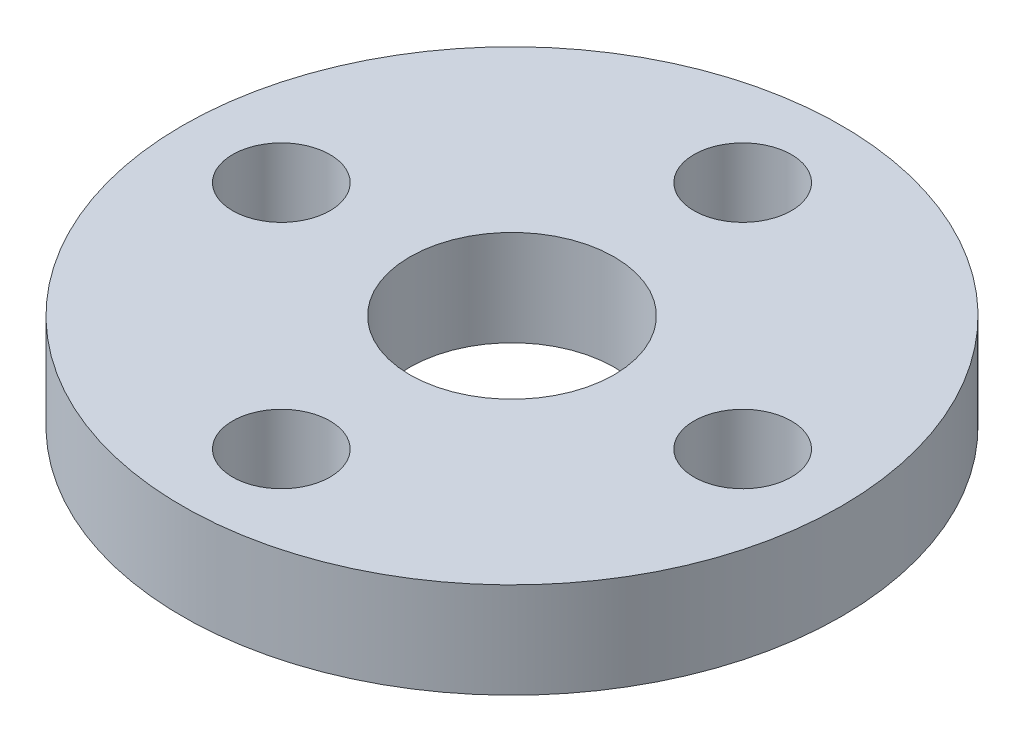
ISO-10303-21;
HEADER;
FILE_DESCRIPTION(('STEP AP214'),'2;1');
FILE_NAME('part.step','',(''),(''),'','','');
FILE_SCHEMA(('AUTOMOTIVE_DESIGN { 1 0 10303 214 1 1 1 1 }'));
ENDSEC;
DATA;
#1=APPLICATION_CONTEXT('core data for automotive mechanical design processes');
#2=APPLICATION_PROTOCOL_DEFINITION('international standard','automotive_design',2000,#1);
#3=PRODUCT_CONTEXT('',#1,'mechanical');
#4=PRODUCT('Part','Part','',(#3));
#5=PRODUCT_RELATED_PRODUCT_CATEGORY('part','',(#4));
#6=PRODUCT_DEFINITION_FORMATION('','',#4);
#7=PRODUCT_DEFINITION_CONTEXT('part definition',#1,'design');
#8=PRODUCT_DEFINITION('design','',#6,#7);
#9=PRODUCT_DEFINITION_SHAPE('','',#8);
#10=(LENGTH_UNIT() NAMED_UNIT(*) SI_UNIT(.MILLI.,.METRE.));
#11=(NAMED_UNIT(*) PLANE_ANGLE_UNIT() SI_UNIT($,.RADIAN.));
#12=(NAMED_UNIT(*) SI_UNIT($,.STERADIAN.) SOLID_ANGLE_UNIT());
#13=UNCERTAINTY_MEASURE_WITH_UNIT(LENGTH_MEASURE(1.E-05),#10,'distance_accuracy_value','');
#14=(GEOMETRIC_REPRESENTATION_CONTEXT(3) GLOBAL_UNCERTAINTY_ASSIGNED_CONTEXT((#13)) GLOBAL_UNIT_ASSIGNED_CONTEXT((#10,
#11,#12)) REPRESENTATION_CONTEXT('',''));
#15=CARTESIAN_POINT('',(0.,0.,0.));
#16=DIRECTION('',(0.,0.,1.));
#17=DIRECTION('',(1.,0.,0.));
#18=AXIS2_PLACEMENT_3D('',#15,#16,#17);
#19=CARTESIAN_POINT('',(-45.,48.15,13.5));
#20=DIRECTION('',(0.,1.,0.));
#21=DIRECTION('',(0.,0.,1.));
#22=AXIS2_PLACEMENT_3D('',#19,#20,#21);
#23=PLANE('',#22);
#24=CARTESIAN_POINT('',(-38.,48.15,10.));
#25=DIRECTION('',(0.,-1.,0.));
#26=DIRECTION('',(0.,0.,-1.));
#27=AXIS2_PLACEMENT_3D('',#24,#25,#26);
#28=CIRCLE('',#27,1.47782604588);
#29=CARTESIAN_POINT('',(-38.,48.15,8.52217395412));
#30=VERTEX_POINT('',#29);
#31=EDGE_CURVE('E10',#30,#30,#28,.T.);
#32=ORIENTED_EDGE('',*,*,#31,.T.);
#33=EDGE_LOOP('',(#32));
#34=FACE_BOUND('',#33,.T.);
#35=CARTESIAN_POINT('',(-45.,48.15,2.99999999999994));
#36=DIRECTION('',(0.,-1.,0.));
#37=DIRECTION('',(-1.,0.,0.));
#38=AXIS2_PLACEMENT_3D('',#35,#36,#37);
#39=CIRCLE('',#38,1.47782604588);
#40=CARTESIAN_POINT('',(-46.47782604588,48.15,2.99999999999994));
#41=VERTEX_POINT('',#40);
#42=EDGE_CURVE('E24',#41,#41,#39,.T.);
#43=ORIENTED_EDGE('',*,*,#42,.T.);
#44=EDGE_LOOP('',(#43));
#45=FACE_BOUND('',#44,.T.);
#46=CARTESIAN_POINT('',(-52.,48.15,10.));
#47=DIRECTION('',(0.,1.,0.));
#48=DIRECTION('',(0.,0.,1.));
#49=AXIS2_PLACEMENT_3D('',#46,#47,#48);
#50=CIRCLE('',#49,1.47782604588);
#51=CARTESIAN_POINT('',(-52.,48.15,11.47782604588));
#52=VERTEX_POINT('',#51);
#53=EDGE_CURVE('E34',#52,#52,#50,.T.);
#54=ORIENTED_EDGE('',*,*,#53,.F.);
#55=EDGE_LOOP('',(#54));
#56=FACE_BOUND('',#55,.T.);
#57=CARTESIAN_POINT('',(-45.,48.15,17.));
#58=DIRECTION('',(0.,-1.,0.));
#59=DIRECTION('',(1.,0.,0.));
#60=AXIS2_PLACEMENT_3D('',#57,#58,#59);
#61=CIRCLE('',#60,1.47782604588);
#62=CARTESIAN_POINT('',(-43.52217395412,48.15,17.));
#63=VERTEX_POINT('',#62);
#64=EDGE_CURVE('E64',#63,#63,#61,.T.);
#65=ORIENTED_EDGE('',*,*,#64,.T.);
#66=EDGE_LOOP('',(#65));
#67=FACE_BOUND('',#66,.T.);
#68=CARTESIAN_POINT('',(-45.,48.15,10.));
#69=DIRECTION('',(0.,1.,0.));
#70=DIRECTION('',(1.,0.,0.));
#71=AXIS2_PLACEMENT_3D('',#68,#69,#70);
#72=CIRCLE('',#71,10.);
#73=CARTESIAN_POINT('',(-35.,48.15,10.));
#74=VERTEX_POINT('',#73);
#75=EDGE_CURVE('E58',#74,#74,#72,.T.);
#76=ORIENTED_EDGE('',*,*,#75,.T.);
#77=EDGE_LOOP('',(#76));
#78=FACE_BOUND('',#77,.T.);
#79=CARTESIAN_POINT('',(-45.,48.15,10.));
#80=DIRECTION('',(0.,1.,0.));
#81=DIRECTION('',(0.,0.,1.));
#82=AXIS2_PLACEMENT_3D('',#79,#80,#81);
#83=CIRCLE('',#82,3.1);
#84=CARTESIAN_POINT('',(-45.,48.15,13.1));
#85=VERTEX_POINT('',#84);
#86=EDGE_CURVE('E72',#85,#85,#83,.F.);
#87=ORIENTED_EDGE('',*,*,#86,.T.);
#88=EDGE_LOOP('',(#87));
#89=FACE_BOUND('',#88,.T.);
#90=ADVANCED_FACE('F15',(#34,#45,#56,#67,#78,#89),#23,.T.);
#91=CARTESIAN_POINT('',(-45.,45.25,13.5));
#92=DIRECTION('',(0.,1.,0.));
#93=DIRECTION('',(0.,0.,1.));
#94=AXIS2_PLACEMENT_3D('',#91,#92,#93);
#95=PLANE('',#94);
#96=CARTESIAN_POINT('',(-38.,45.25,10.));
#97=DIRECTION('',(0.,-1.,0.));
#98=DIRECTION('',(0.,0.,-1.));
#99=AXIS2_PLACEMENT_3D('',#96,#97,#98);
#100=CIRCLE('',#99,1.47782604588);
#101=CARTESIAN_POINT('',(-38.,45.25,8.52217395412));
#102=VERTEX_POINT('',#101);
#103=EDGE_CURVE('E19',#102,#102,#100,.T.);
#104=ORIENTED_EDGE('',*,*,#103,.F.);
#105=EDGE_LOOP('',(#104));
#106=FACE_BOUND('',#105,.T.);
#107=CARTESIAN_POINT('',(-45.,45.25,2.99999999999994));
#108=DIRECTION('',(0.,-1.,0.));
#109=DIRECTION('',(-1.,0.,0.));
#110=AXIS2_PLACEMENT_3D('',#107,#108,#109);
#111=CIRCLE('',#110,1.47782604588);
#112=CARTESIAN_POINT('',(-46.47782604588,45.25,2.99999999999994));
#113=VERTEX_POINT('',#112);
#114=EDGE_CURVE('E50',#113,#113,#111,.T.);
#115=ORIENTED_EDGE('',*,*,#114,.F.);
#116=EDGE_LOOP('',(#115));
#117=FACE_BOUND('',#116,.T.);
#118=CARTESIAN_POINT('',(-52.,45.25,10.));
#119=DIRECTION('',(0.,1.,0.));
#120=DIRECTION('',(0.,0.,1.));
#121=AXIS2_PLACEMENT_3D('',#118,#119,#120);
#122=CIRCLE('',#121,1.47782604588);
#123=CARTESIAN_POINT('',(-52.,45.25,11.47782604588));
#124=VERTEX_POINT('',#123);
#125=EDGE_CURVE('E47',#124,#124,#122,.T.);
#126=ORIENTED_EDGE('',*,*,#125,.T.);
#127=EDGE_LOOP('',(#126));
#128=FACE_BOUND('',#127,.T.);
#129=CARTESIAN_POINT('',(-45.,45.25,17.));
#130=DIRECTION('',(0.,-1.,0.));
#131=DIRECTION('',(1.,0.,0.));
#132=AXIS2_PLACEMENT_3D('',#129,#130,#131);
#133=CIRCLE('',#132,1.47782604588);
#134=CARTESIAN_POINT('',(-43.52217395412,45.25,17.));
#135=VERTEX_POINT('',#134);
#136=EDGE_CURVE('E42',#135,#135,#133,.T.);
#137=ORIENTED_EDGE('',*,*,#136,.F.);
#138=EDGE_LOOP('',(#137));
#139=FACE_BOUND('',#138,.T.);
#140=CARTESIAN_POINT('',(-45.,45.25,10.));
#141=DIRECTION('',(0.,1.,0.));
#142=DIRECTION('',(1.,0.,0.));
#143=AXIS2_PLACEMENT_3D('',#140,#141,#142);
#144=CIRCLE('',#143,10.);
#145=CARTESIAN_POINT('',(-35.,45.25,10.));
#146=VERTEX_POINT('',#145);
#147=EDGE_CURVE('E38',#146,#146,#144,.T.);
#148=ORIENTED_EDGE('',*,*,#147,.F.);
#149=EDGE_LOOP('',(#148));
#150=FACE_BOUND('',#149,.T.);
#151=CARTESIAN_POINT('',(-45.,45.25,10.));
#152=DIRECTION('',(0.,-1.,0.));
#153=DIRECTION('',(1.,0.,0.));
#154=AXIS2_PLACEMENT_3D('',#151,#152,#153);
#155=CIRCLE('',#154,3.1);
#156=CARTESIAN_POINT('',(-41.9,45.25,10.));
#157=VERTEX_POINT('',#156);
#158=EDGE_CURVE('E43',#157,#157,#155,.T.);
#159=ORIENTED_EDGE('',*,*,#158,.F.);
#160=EDGE_LOOP('',(#159));
#161=FACE_BOUND('',#160,.T.);
#162=ADVANCED_FACE('F83',(#106,#117,#128,#139,#150,#161),#95,.F.);
#163=CARTESIAN_POINT('',(-45.,48.15,2.99999999999994));
#164=DIRECTION('',(0.,-1.,0.));
#165=DIRECTION('',(0.,0.,-1.));
#166=AXIS2_PLACEMENT_3D('',#163,#164,#165);
#167=CYLINDRICAL_SURFACE('',#166,1.47782604588);
#168=ORIENTED_EDGE('',*,*,#42,.F.);
#169=EDGE_LOOP('',(#168));
#170=FACE_BOUND('',#169,.T.);
#171=ORIENTED_EDGE('',*,*,#114,.T.);
#172=EDGE_LOOP('',(#171));
#173=FACE_BOUND('',#172,.T.);
#174=ADVANCED_FACE('F101',(#170,#173),#167,.F.);
#175=CARTESIAN_POINT('',(-52.,48.15,10.));
#176=DIRECTION('',(0.,-1.,0.));
#177=DIRECTION('',(0.,0.,-1.));
#178=AXIS2_PLACEMENT_3D('',#175,#176,#177);
#179=CYLINDRICAL_SURFACE('',#178,1.47782604588);
#180=ORIENTED_EDGE('',*,*,#53,.T.);
#181=EDGE_LOOP('',(#180));
#182=FACE_BOUND('',#181,.T.);
#183=ORIENTED_EDGE('',*,*,#125,.F.);
#184=EDGE_LOOP('',(#183));
#185=FACE_BOUND('',#184,.T.);
#186=ADVANCED_FACE('F78',(#182,#185),#179,.F.);
#187=CARTESIAN_POINT('',(-45.,48.15,17.));
#188=DIRECTION('',(0.,-1.,0.));
#189=DIRECTION('',(0.,0.,-1.));
#190=AXIS2_PLACEMENT_3D('',#187,#188,#189);
#191=CYLINDRICAL_SURFACE('',#190,1.47782604588);
#192=ORIENTED_EDGE('',*,*,#64,.F.);
#193=EDGE_LOOP('',(#192));
#194=FACE_BOUND('',#193,.T.);
#195=ORIENTED_EDGE('',*,*,#136,.T.);
#196=EDGE_LOOP('',(#195));
#197=FACE_BOUND('',#196,.T.);
#198=ADVANCED_FACE('F118',(#194,#197),#191,.F.);
#199=CARTESIAN_POINT('',(-45.,48.15,10.));
#200=DIRECTION('',(0.,-1.,0.));
#201=DIRECTION('',(0.,0.,-1.));
#202=AXIS2_PLACEMENT_3D('',#199,#200,#201);
#203=CYLINDRICAL_SURFACE('',#202,10.);
#204=ORIENTED_EDGE('',*,*,#75,.F.);
#205=EDGE_LOOP('',(#204));
#206=FACE_BOUND('',#205,.T.);
#207=ORIENTED_EDGE('',*,*,#147,.T.);
#208=EDGE_LOOP('',(#207));
#209=FACE_BOUND('',#208,.T.);
#210=ADVANCED_FACE('F17',(#206,#209),#203,.T.);
#211=CARTESIAN_POINT('',(-38.,48.15,10.));
#212=DIRECTION('',(0.,-1.,0.));
#213=DIRECTION('',(0.,0.,-1.));
#214=AXIS2_PLACEMENT_3D('',#211,#212,#213);
#215=CYLINDRICAL_SURFACE('',#214,1.47782604588);
#216=ORIENTED_EDGE('',*,*,#31,.F.);
#217=EDGE_LOOP('',(#216));
#218=FACE_BOUND('',#217,.T.);
#219=ORIENTED_EDGE('',*,*,#103,.T.);
#220=EDGE_LOOP('',(#219));
#221=FACE_BOUND('',#220,.T.);
#222=ADVANCED_FACE('F113',(#218,#221),#215,.F.);
#223=CARTESIAN_POINT('',(-45.,48.44,10.));
#224=DIRECTION('',(0.,-1.,0.));
#225=DIRECTION('',(0.,0.,-1.));
#226=AXIS2_PLACEMENT_3D('',#223,#224,#225);
#227=CYLINDRICAL_SURFACE('',#226,3.1);
#228=ORIENTED_EDGE('',*,*,#158,.T.);
#229=EDGE_LOOP('',(#228));
#230=FACE_BOUND('',#229,.T.);
#231=ORIENTED_EDGE('',*,*,#86,.F.);
#232=EDGE_LOOP('',(#231));
#233=FACE_BOUND('',#232,.T.);
#234=ADVANCED_FACE('F98',(#230,#233),#227,.F.);
#235=CLOSED_SHELL('',(#90,#162,#174,#186,#198,#210,#222,#234));
#236=MANIFOLD_SOLID_BREP('B1',#235);
#237=ADVANCED_BREP_SHAPE_REPRESENTATION('',(#18,#236),#14);
#238=SHAPE_DEFINITION_REPRESENTATION(#9,#237);
ENDSEC;
END-ISO-10303-21;
